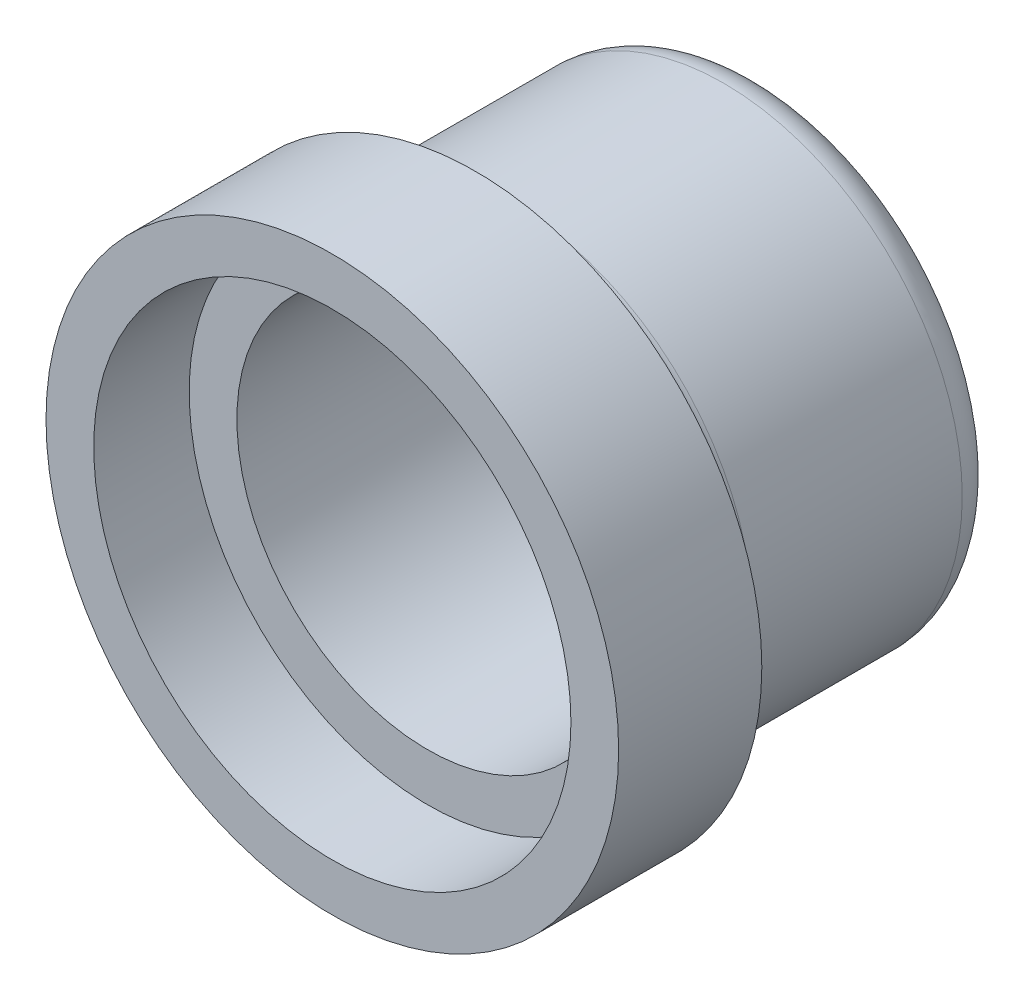
ISO-10303-21;
HEADER;
FILE_DESCRIPTION(('STEP AP214'),'2;1');
FILE_NAME('part.step','',(''),(''),'','','');
FILE_SCHEMA(('AUTOMOTIVE_DESIGN { 1 0 10303 214 1 1 1 1 }'));
ENDSEC;
DATA;
#1=APPLICATION_CONTEXT('core data for automotive mechanical design processes');
#2=APPLICATION_PROTOCOL_DEFINITION('international standard','automotive_design',2000,#1);
#3=PRODUCT_CONTEXT('',#1,'mechanical');
#4=PRODUCT('Part','Part','',(#3));
#5=PRODUCT_RELATED_PRODUCT_CATEGORY('part','',(#4));
#6=PRODUCT_DEFINITION_FORMATION('','',#4);
#7=PRODUCT_DEFINITION_CONTEXT('part definition',#1,'design');
#8=PRODUCT_DEFINITION('design','',#6,#7);
#9=PRODUCT_DEFINITION_SHAPE('','',#8);
#10=(LENGTH_UNIT() NAMED_UNIT(*) SI_UNIT(.MILLI.,.METRE.));
#11=(NAMED_UNIT(*) PLANE_ANGLE_UNIT() SI_UNIT($,.RADIAN.));
#12=(NAMED_UNIT(*) SI_UNIT($,.STERADIAN.) SOLID_ANGLE_UNIT());
#13=UNCERTAINTY_MEASURE_WITH_UNIT(LENGTH_MEASURE(1.E-05),#10,'distance_accuracy_value','');
#14=(GEOMETRIC_REPRESENTATION_CONTEXT(3) GLOBAL_UNCERTAINTY_ASSIGNED_CONTEXT((#13)) GLOBAL_UNIT_ASSIGNED_CONTEXT((#10,
#11,#12)) REPRESENTATION_CONTEXT('',''));
#15=CARTESIAN_POINT('',(0.,0.,0.));
#16=DIRECTION('',(0.,0.,1.));
#17=DIRECTION('',(1.,0.,0.));
#18=AXIS2_PLACEMENT_3D('',#15,#16,#17);
#19=CARTESIAN_POINT('',(0.,0.,7.5));
#20=DIRECTION('',(0.,0.,-1.));
#21=DIRECTION('',(-1.00000000000001,0.,0.));
#22=AXIS2_PLACEMENT_3D('',#19,#20,#21);
#23=CYLINDRICAL_SURFACE('',#22,15.);
#24=CARTESIAN_POINT('',(0.,0.,7.5));
#25=DIRECTION('',(0.,0.,1.));
#26=DIRECTION('',(1.00000000000001,0.,0.));
#27=AXIS2_PLACEMENT_3D('',#24,#25,#26);
#28=CIRCLE('',#27,15.);
#29=CARTESIAN_POINT('',(15.0000000000001,0.,7.5));
#30=VERTEX_POINT('',#29);
#31=EDGE_CURVE('E64',#30,#30,#28,.T.);
#32=ORIENTED_EDGE('',*,*,#31,.F.);
#33=EDGE_LOOP('',(#32));
#34=FACE_BOUND('',#33,.T.);
#35=CARTESIAN_POINT('',(0.,0.,0.));
#36=DIRECTION('',(0.,0.,1.));
#37=DIRECTION('',(1.00000000000001,0.,0.));
#38=AXIS2_PLACEMENT_3D('',#35,#36,#37);
#39=CIRCLE('',#38,15.);
#40=CARTESIAN_POINT('',(15.0000000000001,0.,0.));
#41=VERTEX_POINT('',#40);
#42=EDGE_CURVE('E65',#41,#41,#39,.T.);
#43=ORIENTED_EDGE('',*,*,#42,.T.);
#44=EDGE_LOOP('',(#43));
#45=FACE_BOUND('',#44,.T.);
#46=ADVANCED_FACE('F44',(#34,#45),#23,.T.);
#47=CARTESIAN_POINT('',(0.,0.,7.5));
#48=DIRECTION('',(0.,0.,1.));
#49=DIRECTION('',(1.00000000000001,0.,0.));
#50=AXIS2_PLACEMENT_3D('',#47,#48,#49);
#51=PLANE('',#50);
#52=CARTESIAN_POINT('',(0.,0.,7.5));
#53=DIRECTION('',(0.,0.,1.));
#54=DIRECTION('',(1.00000000000001,0.,0.));
#55=AXIS2_PLACEMENT_3D('',#52,#53,#54);
#56=CIRCLE('',#55,12.5);
#57=CARTESIAN_POINT('',(12.5000000000001,0.,7.5));
#58=VERTEX_POINT('',#57);
#59=EDGE_CURVE('E71',#58,#58,#56,.T.);
#60=ORIENTED_EDGE('',*,*,#59,.F.);
#61=EDGE_LOOP('',(#60));
#62=FACE_BOUND('',#61,.T.);
#63=ORIENTED_EDGE('',*,*,#31,.T.);
#64=EDGE_LOOP('',(#63));
#65=FACE_BOUND('',#64,.T.);
#66=ADVANCED_FACE('F100',(#62,#65),#51,.T.);
#67=CARTESIAN_POINT('',(0.,0.,0.));
#68=DIRECTION('',(0.,0.,1.));
#69=DIRECTION('',(1.00000000000001,0.,0.));
#70=AXIS2_PLACEMENT_3D('',#67,#68,#69);
#71=PLANE('',#70);
#72=CARTESIAN_POINT('',(0.,0.,0.));
#73=DIRECTION('',(0.,0.,1.));
#74=DIRECTION('',(1.00000000000001,0.,0.));
#75=AXIS2_PLACEMENT_3D('',#72,#73,#74);
#76=CIRCLE('',#75,14.5);
#77=CARTESIAN_POINT('',(14.5000000000001,0.,0.));
#78=VERTEX_POINT('',#77);
#79=EDGE_CURVE('E51',#78,#78,#76,.T.);
#80=ORIENTED_EDGE('',*,*,#79,.T.);
#81=EDGE_LOOP('',(#80));
#82=FACE_BOUND('',#81,.T.);
#83=ORIENTED_EDGE('',*,*,#42,.F.);
#84=EDGE_LOOP('',(#83));
#85=FACE_BOUND('',#84,.T.);
#86=ADVANCED_FACE('F106',(#82,#85),#71,.F.);
#87=CARTESIAN_POINT('',(0.,0.,-15.));
#88=DIRECTION('',(0.,0.,1.));
#89=DIRECTION('',(1.00000000000001,0.,0.));
#90=AXIS2_PLACEMENT_3D('',#87,#88,#89);
#91=CYLINDRICAL_SURFACE('',#90,12.5);
#92=CARTESIAN_POINT('',(0.,0.,-2.));
#93=DIRECTION('',(0.,0.,1.));
#94=DIRECTION('',(1.00000000000001,0.,0.));
#95=AXIS2_PLACEMENT_3D('',#92,#93,#94);
#96=CIRCLE('',#95,12.5);
#97=CARTESIAN_POINT('',(12.5000000000001,0.,-2.));
#98=VERTEX_POINT('',#97);
#99=EDGE_CURVE('E55',#98,#98,#96,.F.);
#100=ORIENTED_EDGE('',*,*,#99,.T.);
#101=EDGE_LOOP('',(#100));
#102=FACE_BOUND('',#101,.T.);
#103=CARTESIAN_POINT('',(0.,0.,-13.));
#104=DIRECTION('',(0.,0.,-1.));
#105=DIRECTION('',(-1.00000000000001,0.,0.));
#106=AXIS2_PLACEMENT_3D('',#103,#104,#105);
#107=CIRCLE('',#106,12.5);
#108=CARTESIAN_POINT('',(-12.5000000000001,0.,-13.));
#109=VERTEX_POINT('',#108);
#110=EDGE_CURVE('E59',#109,#109,#107,.F.);
#111=ORIENTED_EDGE('',*,*,#110,.T.);
#112=EDGE_LOOP('',(#111));
#113=FACE_BOUND('',#112,.T.);
#114=ADVANCED_FACE('F97',(#102,#113),#91,.T.);
#115=CARTESIAN_POINT('',(0.,0.,-15.));
#116=DIRECTION('',(0.,0.,-1.));
#117=DIRECTION('',(-1.00000000000001,0.,0.));
#118=AXIS2_PLACEMENT_3D('',#115,#116,#117);
#119=PLANE('',#118);
#120=CARTESIAN_POINT('',(0.,0.,-15.));
#121=DIRECTION('',(0.,0.,-1.));
#122=DIRECTION('',(-1.00000000000001,0.,0.));
#123=AXIS2_PLACEMENT_3D('',#120,#121,#122);
#124=CIRCLE('',#123,10.5);
#125=CARTESIAN_POINT('',(-10.5000000000001,0.,-15.));
#126=VERTEX_POINT('',#125);
#127=EDGE_CURVE('E12',#126,#126,#124,.T.);
#128=ORIENTED_EDGE('',*,*,#127,.T.);
#129=EDGE_LOOP('',(#128));
#130=FACE_BOUND('',#129,.T.);
#131=ADVANCED_FACE('F87',(#130),#119,.T.);
#132=CARTESIAN_POINT('',(0.,0.,7.5));
#133=DIRECTION('',(0.,0.,-1.));
#134=DIRECTION('',(-1.00000000000001,0.,0.));
#135=AXIS2_PLACEMENT_3D('',#132,#133,#134);
#136=CYLINDRICAL_SURFACE('',#135,12.5);
#137=ORIENTED_EDGE('',*,*,#59,.T.);
#138=EDGE_LOOP('',(#137));
#139=FACE_BOUND('',#138,.T.);
#140=CARTESIAN_POINT('',(0.,0.,2.5));
#141=DIRECTION('',(0.,0.,1.));
#142=DIRECTION('',(1.00000000000001,0.,0.));
#143=AXIS2_PLACEMENT_3D('',#140,#141,#142);
#144=CIRCLE('',#143,12.5);
#145=CARTESIAN_POINT('',(12.5000000000001,0.,2.5));
#146=VERTEX_POINT('',#145);
#147=EDGE_CURVE('E74',#146,#146,#144,.T.);
#148=ORIENTED_EDGE('',*,*,#147,.F.);
#149=EDGE_LOOP('',(#148));
#150=FACE_BOUND('',#149,.T.);
#151=ADVANCED_FACE('F85',(#139,#150),#136,.F.);
#152=CARTESIAN_POINT('',(0.,0.,2.5));
#153=DIRECTION('',(0.,0.,1.));
#154=DIRECTION('',(1.00000000000001,0.,0.));
#155=AXIS2_PLACEMENT_3D('',#152,#153,#154);
#156=PLANE('',#155);
#157=CARTESIAN_POINT('',(0.,0.,2.5));
#158=DIRECTION('',(0.,0.,1.));
#159=DIRECTION('',(1.00000000000001,0.,0.));
#160=AXIS2_PLACEMENT_3D('',#157,#158,#159);
#161=CIRCLE('',#160,10.);
#162=CARTESIAN_POINT('',(10.0000000000001,0.,2.5));
#163=VERTEX_POINT('',#162);
#164=EDGE_CURVE('E68',#163,#163,#161,.F.);
#165=ORIENTED_EDGE('',*,*,#164,.T.);
#166=EDGE_LOOP('',(#165));
#167=FACE_BOUND('',#166,.T.);
#168=ORIENTED_EDGE('',*,*,#147,.T.);
#169=EDGE_LOOP('',(#168));
#170=FACE_BOUND('',#169,.T.);
#171=ADVANCED_FACE('F83',(#167,#170),#156,.T.);
#172=CARTESIAN_POINT('',(0.,0.,-15.));
#173=DIRECTION('',(0.,0.,1.));
#174=DIRECTION('',(1.00000000000001,0.,0.));
#175=AXIS2_PLACEMENT_3D('',#172,#173,#174);
#176=CYLINDRICAL_SURFACE('',#175,10.);
#177=CARTESIAN_POINT('',(0.,0.,-12.5));
#178=DIRECTION('',(0.,0.,-1.));
#179=DIRECTION('',(-1.00000000000001,0.,0.));
#180=AXIS2_PLACEMENT_3D('',#177,#178,#179);
#181=CIRCLE('',#180,10.);
#182=CARTESIAN_POINT('',(-10.0000000000001,0.,-12.5));
#183=VERTEX_POINT('',#182);
#184=EDGE_CURVE('E75',#183,#183,#181,.T.);
#185=ORIENTED_EDGE('',*,*,#184,.T.);
#186=EDGE_LOOP('',(#185));
#187=FACE_BOUND('',#186,.T.);
#188=ORIENTED_EDGE('',*,*,#164,.F.);
#189=EDGE_LOOP('',(#188));
#190=FACE_BOUND('',#189,.T.);
#191=ADVANCED_FACE('F94',(#187,#190),#176,.F.);
#192=CARTESIAN_POINT('',(0.,0.,-12.5));
#193=DIRECTION('',(0.,0.,-1.));
#194=DIRECTION('',(-1.00000000000001,0.,0.));
#195=AXIS2_PLACEMENT_3D('',#192,#193,#194);
#196=PLANE('',#195);
#197=ORIENTED_EDGE('',*,*,#184,.F.);
#198=EDGE_LOOP('',(#197));
#199=FACE_BOUND('',#198,.T.);
#200=ADVANCED_FACE('F114',(#199),#196,.F.);
#201=CARTESIAN_POINT('',(0.,0.,-2.));
#202=DIRECTION('',(0.,0.,1.));
#203=DIRECTION('',(1.00000000000001,0.,0.));
#204=AXIS2_PLACEMENT_3D('',#201,#202,#203);
#205=TOROIDAL_SURFACE('',#204,14.5,2.);
#206=ORIENTED_EDGE('',*,*,#79,.F.);
#207=EDGE_LOOP('',(#206));
#208=FACE_BOUND('',#207,.T.);
#209=ORIENTED_EDGE('',*,*,#99,.F.);
#210=EDGE_LOOP('',(#209));
#211=FACE_BOUND('',#210,.T.);
#212=ADVANCED_FACE('F112',(#208,#211),#205,.F.);
#213=CARTESIAN_POINT('',(0.,0.,-13.));
#214=DIRECTION('',(0.,0.,-1.));
#215=DIRECTION('',(-1.00000000000001,0.,0.));
#216=AXIS2_PLACEMENT_3D('',#213,#214,#215);
#217=TOROIDAL_SURFACE('',#216,10.5,2.);
#218=ORIENTED_EDGE('',*,*,#110,.F.);
#219=EDGE_LOOP('',(#218));
#220=FACE_BOUND('',#219,.T.);
#221=ORIENTED_EDGE('',*,*,#127,.F.);
#222=EDGE_LOOP('',(#221));
#223=FACE_BOUND('',#222,.T.);
#224=ADVANCED_FACE('F46',(#220,#223),#217,.T.);
#225=CLOSED_SHELL('',(#46,#66,#86,#114,#131,#151,#171,#191,#200,#212,#224));
#226=MANIFOLD_SOLID_BREP('B2',#225);
#227=ADVANCED_BREP_SHAPE_REPRESENTATION('',(#18,#226),#14);
#228=SHAPE_DEFINITION_REPRESENTATION(#9,#227);
ENDSEC;
END-ISO-10303-21;
